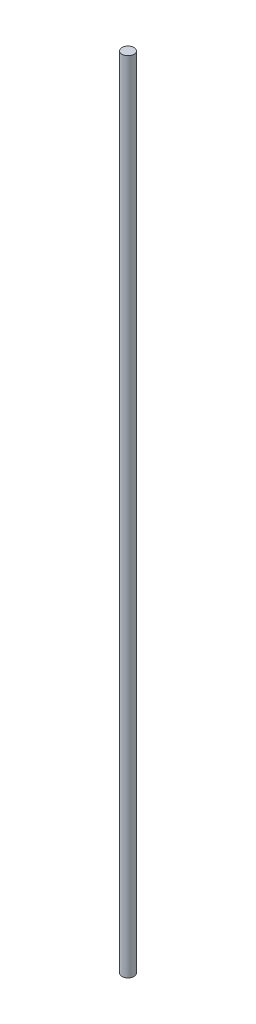
ISO-10303-21;
HEADER;
FILE_DESCRIPTION(('STEP AP214'),'2;1');
FILE_NAME('part.step','',(''),(''),'','','');
FILE_SCHEMA(('AUTOMOTIVE_DESIGN { 1 0 10303 214 1 1 1 1 }'));
ENDSEC;
DATA;
#1=APPLICATION_CONTEXT('core data for automotive mechanical design processes');
#2=APPLICATION_PROTOCOL_DEFINITION('international standard','automotive_design',2000,#1);
#3=PRODUCT_CONTEXT('',#1,'mechanical');
#4=PRODUCT('Part','Part','',(#3));
#5=PRODUCT_RELATED_PRODUCT_CATEGORY('part','',(#4));
#6=PRODUCT_DEFINITION_FORMATION('','',#4);
#7=PRODUCT_DEFINITION_CONTEXT('part definition',#1,'design');
#8=PRODUCT_DEFINITION('design','',#6,#7);
#9=PRODUCT_DEFINITION_SHAPE('','',#8);
#10=(LENGTH_UNIT() NAMED_UNIT(*) SI_UNIT(.MILLI.,.METRE.));
#11=(NAMED_UNIT(*) PLANE_ANGLE_UNIT() SI_UNIT($,.RADIAN.));
#12=(NAMED_UNIT(*) SI_UNIT($,.STERADIAN.) SOLID_ANGLE_UNIT());
#13=UNCERTAINTY_MEASURE_WITH_UNIT(LENGTH_MEASURE(1.E-05),#10,'distance_accuracy_value','');
#14=(GEOMETRIC_REPRESENTATION_CONTEXT(3) GLOBAL_UNCERTAINTY_ASSIGNED_CONTEXT((#13)) GLOBAL_UNIT_ASSIGNED_CONTEXT((#10,
#11,#12)) REPRESENTATION_CONTEXT('',''));
#15=CARTESIAN_POINT('',(0.,0.,0.));
#16=DIRECTION('',(0.,0.,1.));
#17=DIRECTION('',(1.,0.,0.));
#18=AXIS2_PLACEMENT_3D('',#15,#16,#17);
#19=CARTESIAN_POINT('',(0.,415.,0.));
#20=DIRECTION('',(0.,-1.,0.));
#21=DIRECTION('',(0.,0.,-1.));
#22=AXIS2_PLACEMENT_3D('',#19,#20,#21);
#23=CYLINDRICAL_SURFACE('',#22,3.1);
#24=CARTESIAN_POINT('',(0.,415.,0.));
#25=DIRECTION('',(0.,1.,0.));
#26=DIRECTION('',(0.,0.,1.));
#27=AXIS2_PLACEMENT_3D('',#24,#25,#26);
#28=CIRCLE('',#27,3.1);
#29=CARTESIAN_POINT('',(0.,415.,3.1));
#30=VERTEX_POINT('',#29);
#31=EDGE_CURVE('E10',#30,#30,#28,.T.);
#32=ORIENTED_EDGE('',*,*,#31,.F.);
#33=EDGE_LOOP('',(#32));
#34=FACE_BOUND('',#33,.T.);
#35=CARTESIAN_POINT('',(0.,0.,0.));
#36=DIRECTION('',(0.,1.,0.));
#37=DIRECTION('',(0.,0.,1.));
#38=AXIS2_PLACEMENT_3D('',#35,#36,#37);
#39=CIRCLE('',#38,3.1);
#40=CARTESIAN_POINT('',(0.,0.,3.1));
#41=VERTEX_POINT('',#40);
#42=EDGE_CURVE('E38',#41,#41,#39,.T.);
#43=ORIENTED_EDGE('',*,*,#42,.T.);
#44=EDGE_LOOP('',(#43));
#45=FACE_BOUND('',#44,.T.);
#46=ADVANCED_FACE('F35',(#34,#45),#23,.T.);
#47=CARTESIAN_POINT('',(0.,415.,0.));
#48=DIRECTION('',(0.,1.,0.));
#49=DIRECTION('',(0.,0.,1.));
#50=AXIS2_PLACEMENT_3D('',#47,#48,#49);
#51=PLANE('',#50);
#52=ORIENTED_EDGE('',*,*,#31,.T.);
#53=EDGE_LOOP('',(#52));
#54=FACE_BOUND('',#53,.T.);
#55=ADVANCED_FACE('F50',(#54),#51,.T.);
#56=CARTESIAN_POINT('',(0.,0.,0.));
#57=DIRECTION('',(0.,1.,0.));
#58=DIRECTION('',(0.,0.,1.));
#59=AXIS2_PLACEMENT_3D('',#56,#57,#58);
#60=PLANE('',#59);
#61=ORIENTED_EDGE('',*,*,#42,.F.);
#62=EDGE_LOOP('',(#61));
#63=FACE_BOUND('',#62,.T.);
#64=ADVANCED_FACE('F48',(#63),#60,.F.);
#65=CLOSED_SHELL('',(#46,#55,#64));
#66=MANIFOLD_SOLID_BREP('B2',#65);
#67=ADVANCED_BREP_SHAPE_REPRESENTATION('',(#18,#66),#14);
#68=SHAPE_DEFINITION_REPRESENTATION(#9,#67);
ENDSEC;
END-ISO-10303-21;
